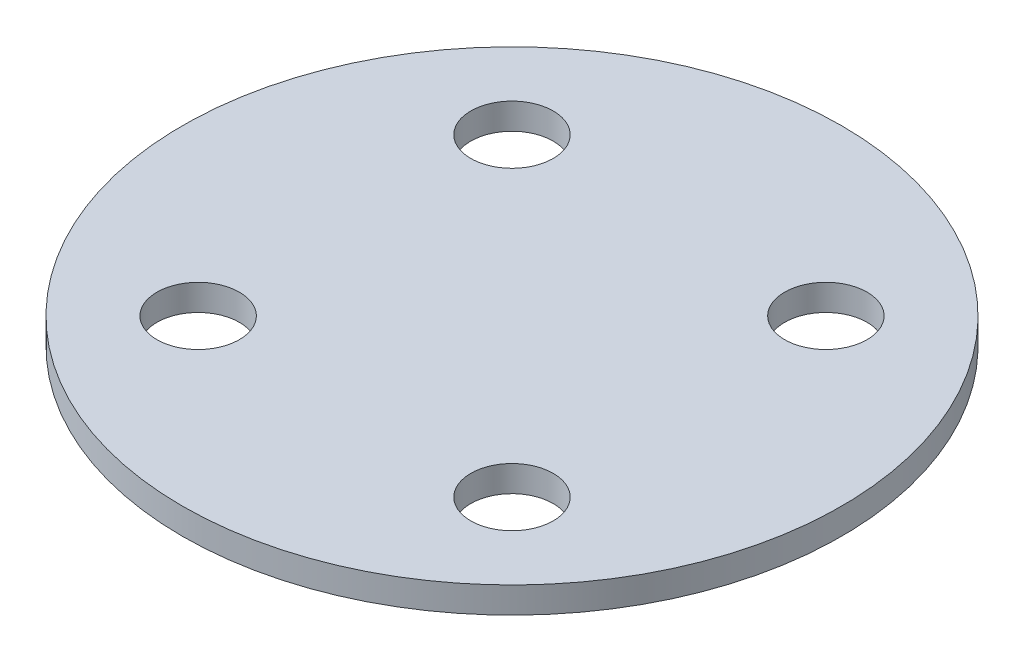
ISO-10303-21;
HEADER;
FILE_DESCRIPTION(('STEP AP214'),'2;1');
FILE_NAME('part.step','',(''),(''),'','','');
FILE_SCHEMA(('AUTOMOTIVE_DESIGN { 1 0 10303 214 1 1 1 1 }'));
ENDSEC;
DATA;
#1=APPLICATION_CONTEXT('core data for automotive mechanical design processes');
#2=APPLICATION_PROTOCOL_DEFINITION('international standard','automotive_design',2000,#1);
#3=PRODUCT_CONTEXT('',#1,'mechanical');
#4=PRODUCT('Part','Part','',(#3));
#5=PRODUCT_RELATED_PRODUCT_CATEGORY('part','',(#4));
#6=PRODUCT_DEFINITION_FORMATION('','',#4);
#7=PRODUCT_DEFINITION_CONTEXT('part definition',#1,'design');
#8=PRODUCT_DEFINITION('design','',#6,#7);
#9=PRODUCT_DEFINITION_SHAPE('','',#8);
#10=(LENGTH_UNIT() NAMED_UNIT(*) SI_UNIT(.MILLI.,.METRE.));
#11=(NAMED_UNIT(*) PLANE_ANGLE_UNIT() SI_UNIT($,.RADIAN.));
#12=(NAMED_UNIT(*) SI_UNIT($,.STERADIAN.) SOLID_ANGLE_UNIT());
#13=UNCERTAINTY_MEASURE_WITH_UNIT(LENGTH_MEASURE(1.E-05),#10,'distance_accuracy_value','');
#14=(GEOMETRIC_REPRESENTATION_CONTEXT(3) GLOBAL_UNCERTAINTY_ASSIGNED_CONTEXT((#13)) GLOBAL_UNIT_ASSIGNED_CONTEXT((#10,
#11,#12)) REPRESENTATION_CONTEXT('',''));
#15=CARTESIAN_POINT('',(0.,0.,0.));
#16=DIRECTION('',(0.,0.,1.));
#17=DIRECTION('',(1.,0.,0.));
#18=AXIS2_PLACEMENT_3D('',#15,#16,#17);
#19=CARTESIAN_POINT('',(-89.0727928211845,84.0800724153638,-47.2587083204986));
#20=DIRECTION('',(0.,-1.,0.));
#21=DIRECTION('',(0.,0.,-1.));
#22=AXIS2_PLACEMENT_3D('',#19,#20,#21);
#23=PLANE('',#22);
#24=CARTESIAN_POINT('',(-83.0727928211843,84.0800724153638,-53.2587083204984));
#25=DIRECTION('',(0.,-1.,0.));
#26=DIRECTION('',(0.,0.,-1.));
#27=AXIS2_PLACEMENT_3D('',#24,#25,#26);
#28=CIRCLE('',#27,1.57499999999999);
#29=CARTESIAN_POINT('',(-83.0727928211843,84.0800724153638,-54.8337083204984));
#30=VERTEX_POINT('',#29);
#31=EDGE_CURVE('E59',#30,#30,#28,.T.);
#32=ORIENTED_EDGE('',*,*,#31,.F.);
#33=EDGE_LOOP('',(#32));
#34=FACE_BOUND('',#33,.T.);
#35=CARTESIAN_POINT('',(-95.0727928211845,84.0800724153638,-41.2587083204987));
#36=DIRECTION('',(0.,-1.,0.));
#37=DIRECTION('',(0.,0.,-1.));
#38=AXIS2_PLACEMENT_3D('',#35,#36,#37);
#39=CIRCLE('',#38,1.57499999999999);
#40=CARTESIAN_POINT('',(-95.0727928211845,84.0800724153638,-42.8337083204986));
#41=VERTEX_POINT('',#40);
#42=EDGE_CURVE('E48',#41,#41,#39,.T.);
#43=ORIENTED_EDGE('',*,*,#42,.F.);
#44=EDGE_LOOP('',(#43));
#45=FACE_BOUND('',#44,.T.);
#46=CARTESIAN_POINT('',(-89.0727928211845,84.0800724153638,-47.2587083204986));
#47=DIRECTION('',(0.,-1.,0.));
#48=DIRECTION('',(0.,0.,-1.));
#49=AXIS2_PLACEMENT_3D('',#46,#47,#48);
#50=CIRCLE('',#49,12.6);
#51=CARTESIAN_POINT('',(-89.0727928211845,84.0800724153638,-59.8587083204986));
#52=VERTEX_POINT('',#51);
#53=EDGE_CURVE('E10',#52,#52,#50,.T.);
#54=ORIENTED_EDGE('',*,*,#53,.T.);
#55=EDGE_LOOP('',(#54));
#56=FACE_BOUND('',#55,.T.);
#57=CARTESIAN_POINT('',(-83.0727928211845,84.0800724153638,-41.2587083204984));
#58=DIRECTION('',(0.,-1.,0.));
#59=DIRECTION('',(0.,0.,-1.));
#60=AXIS2_PLACEMENT_3D('',#57,#58,#59);
#61=CIRCLE('',#60,1.57499999999999);
#62=CARTESIAN_POINT('',(-83.0727928211845,84.0800724153638,-42.8337083204984));
#63=VERTEX_POINT('',#62);
#64=EDGE_CURVE('E53',#63,#63,#61,.T.);
#65=ORIENTED_EDGE('',*,*,#64,.F.);
#66=EDGE_LOOP('',(#65));
#67=FACE_BOUND('',#66,.T.);
#68=CARTESIAN_POINT('',(-95.0727928211843,84.0800724153638,-53.2587083204986));
#69=DIRECTION('',(0.,-1.,0.));
#70=DIRECTION('',(0.,0.,-1.));
#71=AXIS2_PLACEMENT_3D('',#68,#69,#70);
#72=CIRCLE('',#71,1.57499999999999);
#73=CARTESIAN_POINT('',(-95.0727928211843,84.0800724153638,-54.8337083204986));
#74=VERTEX_POINT('',#73);
#75=EDGE_CURVE('E65',#74,#74,#72,.T.);
#76=ORIENTED_EDGE('',*,*,#75,.F.);
#77=EDGE_LOOP('',(#76));
#78=FACE_BOUND('',#77,.T.);
#79=ADVANCED_FACE('F37',(#34,#45,#56,#67,#78),#23,.T.);
#80=CARTESIAN_POINT('',(-89.0727928211845,85.0800724153638,-47.2587083204986));
#81=DIRECTION('',(0.,-1.,0.));
#82=DIRECTION('',(0.,0.,-1.));
#83=AXIS2_PLACEMENT_3D('',#80,#81,#82);
#84=PLANE('',#83);
#85=CARTESIAN_POINT('',(-89.0727928211845,85.0800724153638,-47.2587083204986));
#86=DIRECTION('',(0.,-1.,0.));
#87=DIRECTION('',(0.,0.,-1.));
#88=AXIS2_PLACEMENT_3D('',#85,#86,#87);
#89=CIRCLE('',#88,12.6);
#90=CARTESIAN_POINT('',(-89.0727928211845,85.0800724153638,-59.8587083204986));
#91=VERTEX_POINT('',#90);
#92=EDGE_CURVE('E41',#91,#91,#89,.T.);
#93=ORIENTED_EDGE('',*,*,#92,.F.);
#94=EDGE_LOOP('',(#93));
#95=FACE_BOUND('',#94,.T.);
#96=CARTESIAN_POINT('',(-95.0727928211845,85.0800724153638,-41.2587083204987));
#97=DIRECTION('',(0.,-1.,0.));
#98=DIRECTION('',(0.,0.,-1.));
#99=AXIS2_PLACEMENT_3D('',#96,#97,#98);
#100=CIRCLE('',#99,1.57499999999999);
#101=CARTESIAN_POINT('',(-95.0727928211845,85.0800724153638,-42.8337083204986));
#102=VERTEX_POINT('',#101);
#103=EDGE_CURVE('E50',#102,#102,#100,.T.);
#104=ORIENTED_EDGE('',*,*,#103,.T.);
#105=EDGE_LOOP('',(#104));
#106=FACE_BOUND('',#105,.T.);
#107=CARTESIAN_POINT('',(-83.0727928211845,85.0800724153638,-41.2587083204984));
#108=DIRECTION('',(0.,-1.,0.));
#109=DIRECTION('',(0.,0.,-1.));
#110=AXIS2_PLACEMENT_3D('',#107,#108,#109);
#111=CIRCLE('',#110,1.57499999999999);
#112=CARTESIAN_POINT('',(-83.0727928211845,85.0800724153638,-42.8337083204984));
#113=VERTEX_POINT('',#112);
#114=EDGE_CURVE('E56',#113,#113,#111,.T.);
#115=ORIENTED_EDGE('',*,*,#114,.T.);
#116=EDGE_LOOP('',(#115));
#117=FACE_BOUND('',#116,.T.);
#118=CARTESIAN_POINT('',(-83.0727928211843,85.0800724153638,-53.2587083204984));
#119=DIRECTION('',(0.,-1.,0.));
#120=DIRECTION('',(0.,0.,-1.));
#121=AXIS2_PLACEMENT_3D('',#118,#119,#120);
#122=CIRCLE('',#121,1.57499999999999);
#123=CARTESIAN_POINT('',(-83.0727928211843,85.0800724153638,-54.8337083204984));
#124=VERTEX_POINT('',#123);
#125=EDGE_CURVE('E62',#124,#124,#122,.T.);
#126=ORIENTED_EDGE('',*,*,#125,.T.);
#127=EDGE_LOOP('',(#126));
#128=FACE_BOUND('',#127,.T.);
#129=CARTESIAN_POINT('',(-95.0727928211843,85.0800724153638,-53.2587083204986));
#130=DIRECTION('',(0.,-1.,0.));
#131=DIRECTION('',(0.,0.,-1.));
#132=AXIS2_PLACEMENT_3D('',#129,#130,#131);
#133=CIRCLE('',#132,1.57499999999999);
#134=CARTESIAN_POINT('',(-95.0727928211843,85.0800724153638,-54.8337083204986));
#135=VERTEX_POINT('',#134);
#136=EDGE_CURVE('E68',#135,#135,#133,.T.);
#137=ORIENTED_EDGE('',*,*,#136,.T.);
#138=EDGE_LOOP('',(#137));
#139=FACE_BOUND('',#138,.T.);
#140=ADVANCED_FACE('F78',(#95,#106,#117,#128,#139),#84,.F.);
#141=CARTESIAN_POINT('',(-89.0727928211845,84.0800724153638,-47.2587083204986));
#142=DIRECTION('',(0.,1.,0.));
#143=DIRECTION('',(0.,0.,1.));
#144=AXIS2_PLACEMENT_3D('',#141,#142,#143);
#145=CYLINDRICAL_SURFACE('',#144,12.6);
#146=ORIENTED_EDGE('',*,*,#53,.F.);
#147=EDGE_LOOP('',(#146));
#148=FACE_BOUND('',#147,.T.);
#149=ORIENTED_EDGE('',*,*,#92,.T.);
#150=EDGE_LOOP('',(#149));
#151=FACE_BOUND('',#150,.T.);
#152=ADVANCED_FACE('F39',(#148,#151),#145,.T.);
#153=CARTESIAN_POINT('',(-95.0727928211845,84.0800724153638,-41.2587083204987));
#154=DIRECTION('',(0.,1.,0.));
#155=DIRECTION('',(0.,0.,1.));
#156=AXIS2_PLACEMENT_3D('',#153,#154,#155);
#157=CYLINDRICAL_SURFACE('',#156,1.57499999999999);
#158=ORIENTED_EDGE('',*,*,#42,.T.);
#159=EDGE_LOOP('',(#158));
#160=FACE_BOUND('',#159,.T.);
#161=ORIENTED_EDGE('',*,*,#103,.F.);
#162=EDGE_LOOP('',(#161));
#163=FACE_BOUND('',#162,.T.);
#164=ADVANCED_FACE('F88',(#160,#163),#157,.F.);
#165=CARTESIAN_POINT('',(-83.0727928211845,84.0800724153638,-41.2587083204984));
#166=DIRECTION('',(0.,1.,0.));
#167=DIRECTION('',(0.,0.,1.));
#168=AXIS2_PLACEMENT_3D('',#165,#166,#167);
#169=CYLINDRICAL_SURFACE('',#168,1.57499999999999);
#170=ORIENTED_EDGE('',*,*,#64,.T.);
#171=EDGE_LOOP('',(#170));
#172=FACE_BOUND('',#171,.T.);
#173=ORIENTED_EDGE('',*,*,#114,.F.);
#174=EDGE_LOOP('',(#173));
#175=FACE_BOUND('',#174,.T.);
#176=ADVANCED_FACE('F91',(#172,#175),#169,.F.);
#177=CARTESIAN_POINT('',(-83.0727928211843,84.0800724153638,-53.2587083204984));
#178=DIRECTION('',(0.,1.,0.));
#179=DIRECTION('',(0.,0.,1.));
#180=AXIS2_PLACEMENT_3D('',#177,#178,#179);
#181=CYLINDRICAL_SURFACE('',#180,1.57499999999999);
#182=ORIENTED_EDGE('',*,*,#31,.T.);
#183=EDGE_LOOP('',(#182));
#184=FACE_BOUND('',#183,.T.);
#185=ORIENTED_EDGE('',*,*,#125,.F.);
#186=EDGE_LOOP('',(#185));
#187=FACE_BOUND('',#186,.T.);
#188=ADVANCED_FACE('F95',(#184,#187),#181,.F.);
#189=CARTESIAN_POINT('',(-95.0727928211843,84.0800724153638,-53.2587083204986));
#190=DIRECTION('',(0.,1.,0.));
#191=DIRECTION('',(0.,0.,1.));
#192=AXIS2_PLACEMENT_3D('',#189,#190,#191);
#193=CYLINDRICAL_SURFACE('',#192,1.57499999999999);
#194=ORIENTED_EDGE('',*,*,#75,.T.);
#195=EDGE_LOOP('',(#194));
#196=FACE_BOUND('',#195,.T.);
#197=ORIENTED_EDGE('',*,*,#136,.F.);
#198=EDGE_LOOP('',(#197));
#199=FACE_BOUND('',#198,.T.);
#200=ADVANCED_FACE('F74',(#196,#199),#193,.F.);
#201=CLOSED_SHELL('',(#79,#140,#152,#164,#176,#188,#200));
#202=MANIFOLD_SOLID_BREP('B2',#201);
#203=ADVANCED_BREP_SHAPE_REPRESENTATION('',(#18,#202),#14);
#204=SHAPE_DEFINITION_REPRESENTATION(#9,#203);
ENDSEC;
END-ISO-10303-21;
